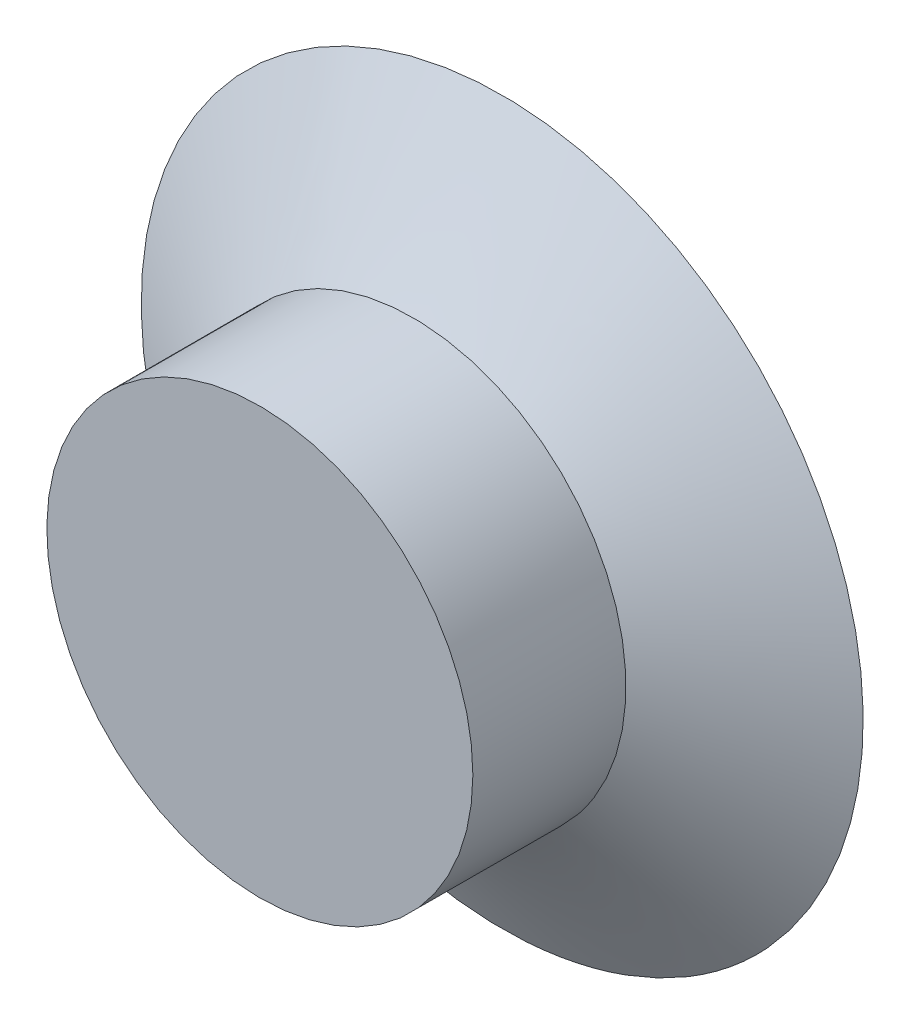
ISO-10303-21;
HEADER;
FILE_DESCRIPTION(('STEP AP214'),'2;1');
FILE_NAME('part.step','',(''),(''),'','','');
FILE_SCHEMA(('AUTOMOTIVE_DESIGN { 1 0 10303 214 1 1 1 1 }'));
ENDSEC;
DATA;
#1=APPLICATION_CONTEXT('core data for automotive mechanical design processes');
#2=APPLICATION_PROTOCOL_DEFINITION('international standard','automotive_design',2000,#1);
#3=PRODUCT_CONTEXT('',#1,'mechanical');
#4=PRODUCT('Part','Part','',(#3));
#5=PRODUCT_RELATED_PRODUCT_CATEGORY('part','',(#4));
#6=PRODUCT_DEFINITION_FORMATION('','',#4);
#7=PRODUCT_DEFINITION_CONTEXT('part definition',#1,'design');
#8=PRODUCT_DEFINITION('design','',#6,#7);
#9=PRODUCT_DEFINITION_SHAPE('','',#8);
#10=(LENGTH_UNIT() NAMED_UNIT(*) SI_UNIT(.MILLI.,.METRE.));
#11=(NAMED_UNIT(*) PLANE_ANGLE_UNIT() SI_UNIT($,.RADIAN.));
#12=(NAMED_UNIT(*) SI_UNIT($,.STERADIAN.) SOLID_ANGLE_UNIT());
#13=UNCERTAINTY_MEASURE_WITH_UNIT(LENGTH_MEASURE(1.E-05),#10,'distance_accuracy_value','');
#14=(GEOMETRIC_REPRESENTATION_CONTEXT(3) GLOBAL_UNCERTAINTY_ASSIGNED_CONTEXT((#13)) GLOBAL_UNIT_ASSIGNED_CONTEXT((#10,
#11,#12)) REPRESENTATION_CONTEXT('',''));
#15=CARTESIAN_POINT('',(0.,0.,0.));
#16=DIRECTION('',(0.,0.,1.));
#17=DIRECTION('',(1.,0.,0.));
#18=AXIS2_PLACEMENT_3D('',#15,#16,#17);
#19=CARTESIAN_POINT('',(0.,0.,19.));
#20=DIRECTION('',(0.,0.,-1.));
#21=DIRECTION('',(-1.,0.,0.));
#22=AXIS2_PLACEMENT_3D('',#19,#20,#21);
#23=CYLINDRICAL_SURFACE('',#22,16.7);
#24=CARTESIAN_POINT('',(0.,0.,19.));
#25=DIRECTION('',(0.,0.,1.));
#26=DIRECTION('',(1.,0.,0.));
#27=AXIS2_PLACEMENT_3D('',#24,#25,#26);
#28=CIRCLE('',#27,16.7);
#29=CARTESIAN_POINT('',(16.7,0.,19.));
#30=VERTEX_POINT('',#29);
#31=EDGE_CURVE('E11',#30,#30,#28,.T.);
#32=ORIENTED_EDGE('',*,*,#31,.F.);
#33=EDGE_LOOP('',(#32));
#34=FACE_BOUND('',#33,.T.);
#35=CARTESIAN_POINT('',(0.,0.,7.));
#36=DIRECTION('',(0.,0.,1.));
#37=DIRECTION('',(1.,0.,0.));
#38=AXIS2_PLACEMENT_3D('',#35,#36,#37);
#39=CIRCLE('',#38,16.7);
#40=CARTESIAN_POINT('',(-10.8457824071141,12.6987796255205,7.));
#41=VERTEX_POINT('',#40);
#42=EDGE_CURVE('E41',#41,#41,#39,.F.);
#43=ORIENTED_EDGE('',*,*,#42,.F.);
#44=EDGE_LOOP('',(#43));
#45=FACE_BOUND('',#44,.T.);
#46=ADVANCED_FACE('F35',(#34,#45),#23,.T.);
#47=CARTESIAN_POINT('',(0.,0.,19.));
#48=DIRECTION('',(0.,0.,1.));
#49=DIRECTION('',(1.,0.,0.));
#50=AXIS2_PLACEMENT_3D('',#47,#48,#49);
#51=PLANE('',#50);
#52=ORIENTED_EDGE('',*,*,#31,.T.);
#53=EDGE_LOOP('',(#52));
#54=FACE_BOUND('',#53,.T.);
#55=ADVANCED_FACE('F73',(#54),#51,.T.);
#56=CARTESIAN_POINT('',(0.,0.,0.));
#57=DIRECTION('',(0.,0.,1.));
#58=DIRECTION('',(1.,0.,0.));
#59=AXIS2_PLACEMENT_3D('',#56,#57,#58);
#60=PLANE('',#59);
#61=CARTESIAN_POINT('',(0.,0.,0.));
#62=DIRECTION('',(0.,0.,1.));
#63=DIRECTION('',(1.,0.,0.));
#64=AXIS2_PLACEMENT_3D('',#61,#62,#63);
#65=CIRCLE('',#64,28.3);
#66=CARTESIAN_POINT('',(-12.2102060927712,25.5303910501201,0.));
#67=VERTEX_POINT('',#66);
#68=EDGE_CURVE('E45',#67,#67,#65,.T.);
#69=ORIENTED_EDGE('',*,*,#68,.F.);
#70=EDGE_LOOP('',(#69));
#71=FACE_BOUND('',#70,.T.);
#72=ADVANCED_FACE('F71',(#71),#60,.F.);
#73=CARTESIAN_POINT('',(-10.8457824071141,12.6987796255205,7.));
#74=CARTESIAN_POINT('',(-12.2102060927712,25.5303910501201,0.));
#75=CARTESIAN_POINT('',(14.551776843927,34.3903444397487,7.));
#76=CARTESIAN_POINT('',(38.8505760074691,49.9508032356624,0.));
#77=CARTESIAN_POINT('',(36.2433416581551,8.99278518870762,7.));
#78=CARTESIAN_POINT('',(63.2709881930114,-1.10997886457783,0.));
#79=CARTESIAN_POINT('',(10.8457824071141,-12.6987796255205,7.));
#80=CARTESIAN_POINT('',(12.2102060927712,-25.5303910501201,0.));
#81=CARTESIAN_POINT('',(-14.551776843927,-34.3903444397487,7.));
#82=CARTESIAN_POINT('',(-38.8505760074691,-49.9508032356624,0.));
#83=CARTESIAN_POINT('',(-36.2433416581551,-8.99278518870762,7.));
#84=CARTESIAN_POINT('',(-63.2709881930114,1.10997886457784,0.));
#85=CARTESIAN_POINT('',(-10.8457824071141,12.6987796255205,7.));
#86=CARTESIAN_POINT('',(-12.2102060927712,25.5303910501201,0.));
#87=(BOUNDED_SURFACE() B_SPLINE_SURFACE(3,1,((#73,#74),(#75,#76),(#77,#78),(#79,#80),(#81,#82),
(#83,#84),(#85,#86)),.UNSPECIFIED.,.T.,.F.,.F.) B_SPLINE_SURFACE_WITH_KNOTS((4,3,4),(2,2),(0.,
0.5,1.),(0.,1.),.UNSPECIFIED.) GEOMETRIC_REPRESENTATION_ITEM() RATIONAL_B_SPLINE_SURFACE(((1.,
1.),(0.333333333333333,0.333333333333333),(0.333333333333333,0.333333333333333),(1.,1.),
(0.333333333333333,0.333333333333333),(0.333333333333333,0.333333333333333),(1.,1.))) REPRESENTATION_ITEM('') SURFACE());
#88=CARTESIAN_POINT('',(-10.8457824071141,12.6987796255205,7.));
#89=CARTESIAN_POINT('',(-10.8599951538397,12.8324422445268,6.92708333333333));
#90=CARTESIAN_POINT('',(-10.8742079005653,12.966104863533,6.85416666666667));
#91=CARTESIAN_POINT('',(-10.9026333940164,13.2334301015455,6.70833333333333));
#92=CARTESIAN_POINT('',(-10.916846140742,13.3670927205517,6.63541666666667));
#93=CARTESIAN_POINT('',(-10.9452716341932,13.6344179585642,6.48958333333333));
#94=CARTESIAN_POINT('',(-10.9594843809188,13.7680805775705,6.41666666666667));
#95=CARTESIAN_POINT('',(-10.98790987437,14.035405815583,6.27083333333333));
#96=CARTESIAN_POINT('',(-11.0021226210956,14.1690684345892,6.19791666666667));
#97=CARTESIAN_POINT('',(-11.0305481145468,14.4363936726017,6.05208333333333));
#98=CARTESIAN_POINT('',(-11.0447608612724,14.570056291608,5.97916666666667));
#99=CARTESIAN_POINT('',(-11.0731863547236,14.8373815296204,5.83333333333333));
#100=CARTESIAN_POINT('',(-11.0873991014492,14.9710441486267,5.76041666666667));
#101=CARTESIAN_POINT('',(-11.1158245949004,15.2383693866392,5.61458333333333));
#102=CARTESIAN_POINT('',(-11.130037341626,15.3720320056454,5.54166666666667));
#103=CARTESIAN_POINT('',(-11.1584628350772,15.6393572436579,5.39583333333333));
#104=CARTESIAN_POINT('',(-11.1726755818027,15.7730198626642,5.32291666666667));
#105=CARTESIAN_POINT('',(-11.2011010752539,16.0403451006767,5.17708333333333));
#106=CARTESIAN_POINT('',(-11.2153138219795,16.1740077196829,5.10416666666667));
#107=CARTESIAN_POINT('',(-11.2437393154307,16.4413329576954,4.95833333333333));
#108=CARTESIAN_POINT('',(-11.2579520621563,16.5749955767016,4.88541666666667));
#109=CARTESIAN_POINT('',(-11.2863775556075,16.8423208147141,4.73958333333333));
#110=CARTESIAN_POINT('',(-11.3005903023331,16.9759834337204,4.66666666666667));
#111=CARTESIAN_POINT('',(-11.3290157957843,17.2433086717329,4.52083333333333));
#112=CARTESIAN_POINT('',(-11.3432285425099,17.3769712907391,4.44791666666667));
#113=CARTESIAN_POINT('',(-11.3716540359611,17.6442965287516,4.30208333333333));
#114=CARTESIAN_POINT('',(-11.3858667826867,17.7779591477579,4.22916666666667));
#115=CARTESIAN_POINT('',(-11.4142922761379,18.0452843857704,4.08333333333333));
#116=CARTESIAN_POINT('',(-11.4285050228634,18.1789470047766,4.01041666666667));
#117=CARTESIAN_POINT('',(-11.4569305163146,18.4462722427891,3.86458333333333));
#118=CARTESIAN_POINT('',(-11.4711432630402,18.5799348617953,3.79166666666667));
#119=CARTESIAN_POINT('',(-11.4995687564914,18.8472600998078,3.64583333333333));
#120=CARTESIAN_POINT('',(-11.513781503217,18.9809227188141,3.57291666666667));
#121=CARTESIAN_POINT('',(-11.5422069966682,19.2482479568266,3.42708333333333));
#122=CARTESIAN_POINT('',(-11.5564197433938,19.3819105758328,3.35416666666667));
#123=CARTESIAN_POINT('',(-11.584845236845,19.6492358138453,3.20833333333333));
#124=CARTESIAN_POINT('',(-11.5990579835706,19.7828984328516,3.13541666666667));
#125=CARTESIAN_POINT('',(-11.6274834770218,20.050223670864,2.98958333333333));
#126=CARTESIAN_POINT('',(-11.6416962237474,20.1838862898703,2.91666666666667));
#127=CARTESIAN_POINT('',(-11.6701217171986,20.4512115278828,2.77083333333333));
#128=CARTESIAN_POINT('',(-11.6843344639242,20.584874146889,2.69791666666667));
#129=CARTESIAN_POINT('',(-11.7127599573753,20.8521993849015,2.55208333333333));
#130=CARTESIAN_POINT('',(-11.7269727041009,20.9858620039078,2.47916666666667));
#131=CARTESIAN_POINT('',(-11.7553981975521,21.2531872419203,2.33333333333333));
#132=CARTESIAN_POINT('',(-11.7696109442777,21.3868498609265,2.26041666666667));
#133=CARTESIAN_POINT('',(-11.7980364377289,21.654175098939,2.11458333333333));
#134=CARTESIAN_POINT('',(-11.8122491844545,21.7878377179452,2.04166666666667));
#135=CARTESIAN_POINT('',(-11.8406746779057,22.0551629559577,1.89583333333333));
#136=CARTESIAN_POINT('',(-11.8548874246313,22.188825574964,1.82291666666667));
#137=CARTESIAN_POINT('',(-11.8833129180825,22.4561508129765,1.67708333333333));
#138=CARTESIAN_POINT('',(-11.8975256648081,22.5898134319827,1.60416666666667));
#139=CARTESIAN_POINT('',(-11.9259511582593,22.8571386699952,1.45833333333333));
#140=CARTESIAN_POINT('',(-11.9401639049849,22.9908012890015,1.38541666666667));
#141=CARTESIAN_POINT('',(-11.968589398436,23.258126527014,1.23958333333333));
#142=CARTESIAN_POINT('',(-11.9828021451616,23.3917891460202,1.16666666666667));
#143=CARTESIAN_POINT('',(-12.0112276386128,23.6591143840327,1.02083333333333));
#144=CARTESIAN_POINT('',(-12.0254403853384,23.7927770030389,0.947916666666667));
#145=CARTESIAN_POINT('',(-12.0538658787896,24.0601022410514,0.802083333333333));
#146=CARTESIAN_POINT('',(-12.0680786255152,24.1937648600577,0.729166666666666));
#147=CARTESIAN_POINT('',(-12.0965041189664,24.4610900980702,0.583333333333333));
#148=CARTESIAN_POINT('',(-12.110716865692,24.5947527170764,0.510416666666667));
#149=CARTESIAN_POINT('',(-12.1391423591432,24.8620779550889,0.364583333333334));
#150=CARTESIAN_POINT('',(-12.1533551058688,24.9957405740952,0.291666666666667));
#151=CARTESIAN_POINT('',(-12.18178059932,25.2630658121076,0.145833333333333));
#152=CARTESIAN_POINT('',(-12.1959933460456,25.3967284311139,0.0729166666666656));
#153=CARTESIAN_POINT('',(-12.2102060927712,25.5303910501201,0.));
#154=B_SPLINE_CURVE_WITH_KNOTS('',3,(#88,#89,#90,#91,#92,#93,#94,#95,#96,#97,#98,#99,#100,#101,
#102,#103,#104,#105,#106,#107,#108,#109,#110,#111,#112,#113,#114,#115,#116,#117,#118,#119,#120,
#121,#122,#123,#124,#125,#126,#127,#128,#129,#130,#131,#132,#133,#134,#135,#136,#137,#138,#139,
#140,#141,#142,#143,#144,#145,#146,#147,#148,#149,#150,#151,#152,#153),.UNSPECIFIED.,.F.,.F.,(4,
2,2,2,2,2,2,2,2,2,2,2,2,2,2,2,2,2,2,2,2,2,2,2,2,2,2,2,2,2,2,2,4),(0.,0.458760115421832,
0.917520230843666,1.3762803462655,1.83504046168733,2.29380057710916,2.752560692531,
3.21132080795283,3.67008092337466,4.12884103879649,4.58760115421833,5.04636126964016,
5.50512138506199,5.96388150048382,6.42264161590566,6.88140173132749,7.34016184674932,
7.79892196217115,8.25768207759299,8.71644219301482,9.17520230843665,9.63396242385849,
10.0927225392803,10.5514826547021,11.010242770124,11.4690028855458,11.9277630009677,
12.3865231163895,12.8452832318113,13.3040433472331,13.762803462655,14.2215635780768,
14.6803236934986),.UNSPECIFIED.);
#155=EDGE_CURVE('BSEAM60',#41,#67,#154,.T.);
#156=ORIENTED_EDGE('',*,*,#42,.T.);
#157=ORIENTED_EDGE('',*,*,#68,.T.);
#158=ORIENTED_EDGE('',*,*,#155,.T.);
#159=ORIENTED_EDGE('',*,*,#155,.F.);
#160=EDGE_LOOP('',(#156,#158,#157,#159));
#161=FACE_BOUND('',#160,.T.);
#162=ADVANCED_FACE('F60',(#161),#87,.T.);
#163=CLOSED_SHELL('',(#46,#55,#72,#162));
#164=MANIFOLD_SOLID_BREP('B2',#163);
#165=ADVANCED_BREP_SHAPE_REPRESENTATION('',(#18,#164),#14);
#166=SHAPE_DEFINITION_REPRESENTATION(#9,#165);
ENDSEC;
END-ISO-10303-21;
